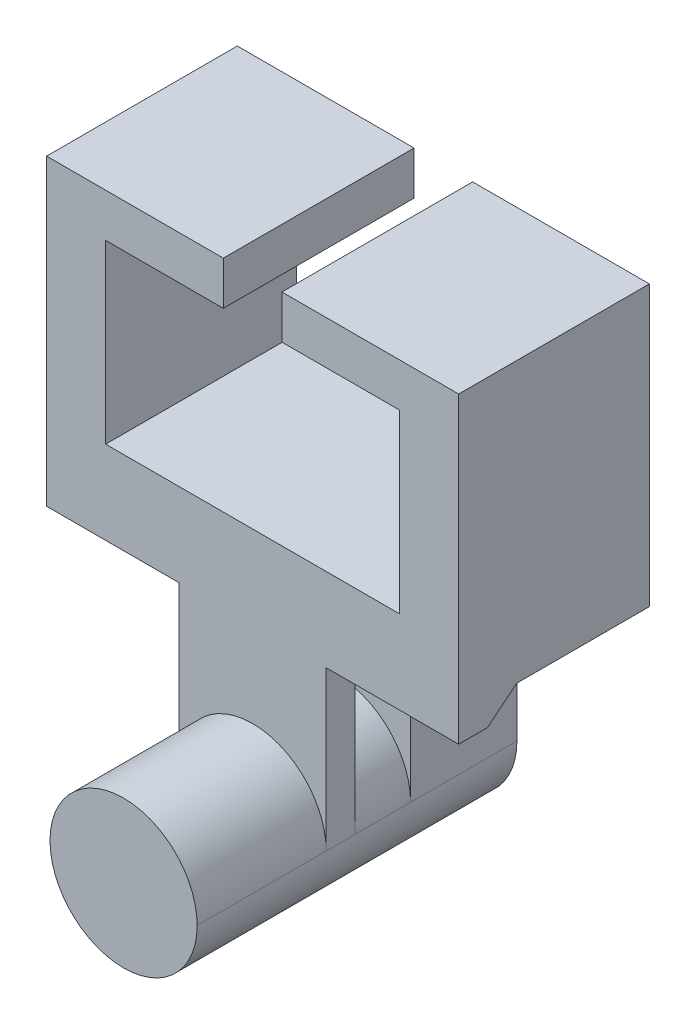
ISO-10303-21;
HEADER;
FILE_DESCRIPTION(('STEP AP214'),'2;1');
FILE_NAME('part.step','',(''),(''),'','','');
FILE_SCHEMA(('AUTOMOTIVE_DESIGN { 1 0 10303 214 1 1 1 1 }'));
ENDSEC;
DATA;
#1=APPLICATION_CONTEXT('core data for automotive mechanical design processes');
#2=APPLICATION_PROTOCOL_DEFINITION('international standard','automotive_design',2000,#1);
#3=PRODUCT_CONTEXT('',#1,'mechanical');
#4=PRODUCT('Part','Part','',(#3));
#5=PRODUCT_RELATED_PRODUCT_CATEGORY('part','',(#4));
#6=PRODUCT_DEFINITION_FORMATION('','',#4);
#7=PRODUCT_DEFINITION_CONTEXT('part definition',#1,'design');
#8=PRODUCT_DEFINITION('design','',#6,#7);
#9=PRODUCT_DEFINITION_SHAPE('','',#8);
#10=(LENGTH_UNIT() NAMED_UNIT(*) SI_UNIT(.MILLI.,.METRE.));
#11=(NAMED_UNIT(*) PLANE_ANGLE_UNIT() SI_UNIT($,.RADIAN.));
#12=(NAMED_UNIT(*) SI_UNIT($,.STERADIAN.) SOLID_ANGLE_UNIT());
#13=UNCERTAINTY_MEASURE_WITH_UNIT(LENGTH_MEASURE(1.E-05),#10,'distance_accuracy_value','');
#14=(GEOMETRIC_REPRESENTATION_CONTEXT(3) GLOBAL_UNCERTAINTY_ASSIGNED_CONTEXT((#13)) GLOBAL_UNIT_ASSIGNED_CONTEXT((#10,
#11,#12)) REPRESENTATION_CONTEXT('',''));
#15=CARTESIAN_POINT('',(0.,0.,0.));
#16=DIRECTION('',(0.,0.,1.));
#17=DIRECTION('',(1.,0.,0.));
#18=AXIS2_PLACEMENT_3D('',#15,#16,#17);
#19=CARTESIAN_POINT('',(0.,39.37,0.));
#20=DIRECTION('',(0.,1.,0.));
#21=DIRECTION('',(0.,0.,1.));
#22=AXIS2_PLACEMENT_3D('',#19,#20,#21);
#23=PLANE('',#22);
#24=DIRECTION('',(0.,0.,1.));
#25=VECTOR('',#24,1.);
#26=CARTESIAN_POINT('',(44.45,39.37,22.95525));
#27=LINE('',#26,#25);
#28=CARTESIAN_POINT('',(44.45,39.37,4.7625));
#29=VERTEX_POINT('',#28);
#30=CARTESIAN_POINT('',(44.45,39.37,10.401879312551));
#31=VERTEX_POINT('',#30);
#32=EDGE_CURVE('E264',#29,#31,#27,.T.);
#33=ORIENTED_EDGE('',*,*,#32,.T.);
#34=DIRECTION('',(1.,0.,0.));
#35=VECTOR('',#34,1.);
#36=CARTESIAN_POINT('',(15.875,39.37,10.401879312551));
#37=LINE('',#36,#35);
#38=CARTESIAN_POINT('',(-44.45,39.37,10.401879312551));
#39=VERTEX_POINT('',#38);
#40=EDGE_CURVE('E73',#39,#31,#37,.T.);
#41=ORIENTED_EDGE('',*,*,#40,.F.);
#42=DIRECTION('',(0.,0.,-1.));
#43=VECTOR('',#42,1.);
#44=CARTESIAN_POINT('',(-44.45,39.37,-18.19275));
#45=LINE('',#44,#43);
#46=CARTESIAN_POINT('',(-44.45,39.37,4.7625));
#47=VERTEX_POINT('',#46);
#48=EDGE_CURVE('E454',#39,#47,#45,.T.);
#49=ORIENTED_EDGE('',*,*,#48,.T.);
#50=DIRECTION('',(-1.,0.,0.));
#51=VECTOR('',#50,1.);
#52=CARTESIAN_POINT('',(-15.875,39.37,4.7625));
#53=LINE('',#52,#51);
#54=EDGE_CURVE('E450',#29,#47,#53,.T.);
#55=ORIENTED_EDGE('',*,*,#54,.F.);
#56=EDGE_LOOP('',(#33,#41,#49,#55));
#57=FACE_BOUND('',#56,.T.);
#58=ADVANCED_FACE('F56',(#57),#23,.F.);
#59=CARTESIAN_POINT('',(15.875,-15.877,22.95525));
#60=DIRECTION('',(-1.,0.,0.));
#61=DIRECTION('',(0.,0.,1.));
#62=AXIS2_PLACEMENT_3D('',#59,#60,#61);
#63=PLANE('',#62);
#64=DIRECTION('',(0.,0.,-1.));
#65=VECTOR('',#64,1.);
#66=CARTESIAN_POINT('',(15.875,34.2396768278377,16.751879312551));
#67=LINE('',#66,#65);
#68=CARTESIAN_POINT('',(15.875,34.2396768278377,22.95525));
#69=VERTEX_POINT('',#68);
#70=CARTESIAN_POINT('',(15.875,34.2396768278377,16.751879312551));
#71=VERTEX_POINT('',#70);
#72=EDGE_CURVE('E237',#69,#71,#67,.T.);
#73=ORIENTED_EDGE('',*,*,#72,.F.);
#74=DIRECTION('',(0.,1.,0.));
#75=VECTOR('',#74,1.);
#76=CARTESIAN_POINT('',(15.875,-15.877,22.95525));
#77=LINE('',#76,#75);
#78=CARTESIAN_POINT('',(15.875,0.,22.95525));
#79=VERTEX_POINT('',#78);
#80=EDGE_CURVE('E250',#79,#69,#77,.T.);
#81=ORIENTED_EDGE('',*,*,#80,.F.);
#82=DIRECTION('',(0.,0.,-1.));
#83=VECTOR('',#82,1.);
#84=CARTESIAN_POINT('',(15.875,0.,50.8));
#85=LINE('',#84,#83);
#86=CARTESIAN_POINT('',(15.875,0.,16.751879312551));
#87=VERTEX_POINT('',#86);
#88=EDGE_CURVE('E271',#87,#79,#85,.F.);
#89=ORIENTED_EDGE('',*,*,#88,.F.);
#90=DIRECTION('',(0.,1.,0.));
#91=VECTOR('',#90,1.);
#92=CARTESIAN_POINT('',(15.875,-15.877,16.751879312551));
#93=LINE('',#92,#91);
#94=EDGE_CURVE('E252',#87,#71,#93,.T.);
#95=ORIENTED_EDGE('',*,*,#94,.T.);
#96=EDGE_LOOP('',(#73,#81,#89,#95));
#97=FACE_BOUND('',#96,.T.);
#98=ADVANCED_FACE('F248',(#97),#63,.F.);
#99=CARTESIAN_POINT('',(-15.875,-15.877,22.95525));
#100=DIRECTION('',(1.,0.,0.));
#101=DIRECTION('',(0.,0.,-1.));
#102=AXIS2_PLACEMENT_3D('',#99,#100,#101);
#103=PLANE('',#102);
#104=DIRECTION('',(0.,0.,1.));
#105=VECTOR('',#104,1.);
#106=CARTESIAN_POINT('',(-15.875,34.2396768278377,16.751879312551));
#107=LINE('',#106,#105);
#108=CARTESIAN_POINT('',(-15.875,34.2396768278377,16.751879312551));
#109=VERTEX_POINT('',#108);
#110=CARTESIAN_POINT('',(-15.875,34.2396768278377,22.95525));
#111=VERTEX_POINT('',#110);
#112=EDGE_CURVE('E477',#109,#111,#107,.T.);
#113=ORIENTED_EDGE('',*,*,#112,.F.);
#114=DIRECTION('',(0.,1.,0.));
#115=VECTOR('',#114,1.);
#116=CARTESIAN_POINT('',(-15.875,-15.877,16.751879312551));
#117=LINE('',#116,#115);
#118=CARTESIAN_POINT('',(-15.875,0.,16.751879312551));
#119=VERTEX_POINT('',#118);
#120=EDGE_CURVE('E262',#119,#109,#117,.T.);
#121=ORIENTED_EDGE('',*,*,#120,.F.);
#122=DIRECTION('',(0.,0.,-1.));
#123=VECTOR('',#122,1.);
#124=CARTESIAN_POINT('',(-15.875,0.,50.8));
#125=LINE('',#124,#123);
#126=CARTESIAN_POINT('',(-15.875,0.,22.95525));
#127=VERTEX_POINT('',#126);
#128=EDGE_CURVE('E275',#119,#127,#125,.F.);
#129=ORIENTED_EDGE('',*,*,#128,.T.);
#130=DIRECTION('',(0.,1.,0.));
#131=VECTOR('',#130,1.);
#132=CARTESIAN_POINT('',(-15.875,-15.877,22.95525));
#133=LINE('',#132,#131);
#134=EDGE_CURVE('E81',#127,#111,#133,.T.);
#135=ORIENTED_EDGE('',*,*,#134,.T.);
#136=EDGE_LOOP('',(#113,#121,#129,#135));
#137=FACE_BOUND('',#136,.T.);
#138=ADVANCED_FACE('F478',(#137),#103,.F.);
#139=CARTESIAN_POINT('',(-15.875,0.,4.7625));
#140=DIRECTION('',(-1.,0.,0.));
#141=DIRECTION('',(0.,0.,1.));
#142=AXIS2_PLACEMENT_3D('',#139,#140,#141);
#143=PLANE('',#142);
#144=DIRECTION('',(0.,1.,0.));
#145=VECTOR('',#144,1.);
#146=CARTESIAN_POINT('',(-15.875,0.,4.7625));
#147=LINE('',#146,#145);
#148=CARTESIAN_POINT('',(-15.875,0.,4.7625));
#149=VERTEX_POINT('',#148);
#150=CARTESIAN_POINT('',(-15.875,33.02,4.7625));
#151=VERTEX_POINT('',#150);
#152=EDGE_CURVE('E346',#149,#151,#147,.T.);
#153=ORIENTED_EDGE('',*,*,#152,.T.);
#154=DIRECTION('',(0.,0.,1.));
#155=VECTOR('',#154,1.);
#156=CARTESIAN_POINT('',(-15.875,33.02,4.7625));
#157=LINE('',#156,#155);
#158=CARTESIAN_POINT('',(-15.875,33.02,-18.19275));
#159=VERTEX_POINT('',#158);
#160=EDGE_CURVE('E522',#159,#151,#157,.T.);
#161=ORIENTED_EDGE('',*,*,#160,.F.);
#162=DIRECTION('',(0.,-1.,0.));
#163=VECTOR('',#162,1.);
#164=CARTESIAN_POINT('',(-15.875,39.37,-18.19275));
#165=LINE('',#164,#163);
#166=CARTESIAN_POINT('',(-15.875,0.,-18.19275));
#167=VERTEX_POINT('',#166);
#168=EDGE_CURVE('E533',#159,#167,#165,.T.);
#169=ORIENTED_EDGE('',*,*,#168,.T.);
#170=DIRECTION('',(0.,0.,-1.));
#171=VECTOR('',#170,1.);
#172=CARTESIAN_POINT('',(-15.875,0.,4.7625));
#173=LINE('',#172,#171);
#174=EDGE_CURVE('E353',#149,#167,#173,.T.);
#175=ORIENTED_EDGE('',*,*,#174,.F.);
#176=EDGE_LOOP('',(#153,#161,#169,#175));
#177=FACE_BOUND('',#176,.T.);
#178=ADVANCED_FACE('F607',(#177),#143,.T.);
#179=CARTESIAN_POINT('',(-15.875,-15.877,16.751879312551));
#180=DIRECTION('',(0.,0.,1.));
#181=DIRECTION('',(1.,0.,0.));
#182=AXIS2_PLACEMENT_3D('',#179,#180,#181);
#183=PLANE('',#182);
#184=DIRECTION('',(-1.,0.,0.));
#185=VECTOR('',#184,1.);
#186=CARTESIAN_POINT('',(15.875,34.2396768278377,16.751879312551));
#187=LINE('',#186,#185);
#188=EDGE_CURVE('E439',#71,#109,#187,.T.);
#189=ORIENTED_EDGE('',*,*,#188,.F.);
#190=ORIENTED_EDGE('',*,*,#94,.F.);
#191=CARTESIAN_POINT('',(0.,0.,16.751879312551));
#192=DIRECTION('',(0.,0.,1.));
#193=DIRECTION('',(1.,0.,0.));
#194=AXIS2_PLACEMENT_3D('',#191,#192,#193);
#195=CIRCLE('',#194,15.875);
#196=EDGE_CURVE('E274',#119,#87,#195,.F.);
#197=ORIENTED_EDGE('',*,*,#196,.F.);
#198=ORIENTED_EDGE('',*,*,#120,.T.);
#199=EDGE_LOOP('',(#189,#190,#197,#198));
#200=FACE_BOUND('',#199,.T.);
#201=ADVANCED_FACE('F464',(#200),#183,.F.);
#202=CARTESIAN_POINT('',(15.875,0.,4.7625));
#203=DIRECTION('',(1.,0.,0.));
#204=DIRECTION('',(0.,0.,-1.));
#205=AXIS2_PLACEMENT_3D('',#202,#203,#204);
#206=PLANE('',#205);
#207=DIRECTION('',(0.,0.,-1.));
#208=VECTOR('',#207,1.);
#209=CARTESIAN_POINT('',(15.875,33.02,4.7625));
#210=LINE('',#209,#208);
#211=CARTESIAN_POINT('',(15.875,33.02,4.7625));
#212=VERTEX_POINT('',#211);
#213=CARTESIAN_POINT('',(15.875,33.02,-18.19275));
#214=VERTEX_POINT('',#213);
#215=EDGE_CURVE('E510',#212,#214,#210,.T.);
#216=ORIENTED_EDGE('',*,*,#215,.F.);
#217=DIRECTION('',(0.,-1.,0.));
#218=VECTOR('',#217,1.);
#219=CARTESIAN_POINT('',(15.875,0.,4.7625));
#220=LINE('',#219,#218);
#221=CARTESIAN_POINT('',(15.875,0.,4.7625));
#222=VERTEX_POINT('',#221);
#223=EDGE_CURVE('E341',#212,#222,#220,.T.);
#224=ORIENTED_EDGE('',*,*,#223,.T.);
#225=DIRECTION('',(0.,0.,-1.));
#226=VECTOR('',#225,1.);
#227=CARTESIAN_POINT('',(15.875,0.,4.7625));
#228=LINE('',#227,#226);
#229=CARTESIAN_POINT('',(15.875,0.,-18.19275));
#230=VERTEX_POINT('',#229);
#231=EDGE_CURVE('E352',#222,#230,#228,.T.);
#232=ORIENTED_EDGE('',*,*,#231,.T.);
#233=DIRECTION('',(0.,1.,0.));
#234=VECTOR('',#233,1.);
#235=CARTESIAN_POINT('',(15.875,39.37,-18.19275));
#236=LINE('',#235,#234);
#237=EDGE_CURVE('E474',#230,#214,#236,.T.);
#238=ORIENTED_EDGE('',*,*,#237,.T.);
#239=EDGE_LOOP('',(#216,#224,#232,#238));
#240=FACE_BOUND('',#239,.T.);
#241=ADVANCED_FACE('F606',(#240),#206,.T.);
#242=CARTESIAN_POINT('',(0.,0.,4.7625));
#243=DIRECTION('',(0.,0.,1.));
#244=DIRECTION('',(1.,0.,0.));
#245=AXIS2_PLACEMENT_3D('',#242,#243,#244);
#246=PLANE('',#245);
#247=DIRECTION('',(-0.975404269823902,0.220423479714163,0.));
#248=VECTOR('',#247,1.);
#249=CARTESIAN_POINT('',(-44.45,39.37,4.7625));
#250=LINE('',#249,#248);
#251=CARTESIAN_POINT('',(-16.3503750353016,33.02,4.7625));
#252=VERTEX_POINT('',#251);
#253=EDGE_CURVE('E501',#252,#47,#250,.T.);
#254=ORIENTED_EDGE('',*,*,#253,.F.);
#255=DIRECTION('',(-1.,0.,0.));
#256=VECTOR('',#255,1.);
#257=CARTESIAN_POINT('',(-15.875,33.02,4.7625));
#258=LINE('',#257,#256);
#259=EDGE_CURVE('E526',#151,#252,#258,.T.);
#260=ORIENTED_EDGE('',*,*,#259,.F.);
#261=ORIENTED_EDGE('',*,*,#152,.F.);
#262=CARTESIAN_POINT('',(0.,0.,4.7625));
#263=DIRECTION('',(0.,0.,1.));
#264=DIRECTION('',(1.,0.,0.));
#265=AXIS2_PLACEMENT_3D('',#262,#263,#264);
#266=CIRCLE('',#265,15.875);
#267=EDGE_CURVE('E646',#222,#149,#266,.T.);
#268=ORIENTED_EDGE('',*,*,#267,.F.);
#269=ORIENTED_EDGE('',*,*,#223,.F.);
#270=DIRECTION('',(-0.976187060183953,-0.216930457818656,0.));
#271=VECTOR('',#270,1.);
#272=CARTESIAN_POINT('',(15.875,33.02,4.7625));
#273=LINE('',#272,#271);
#274=EDGE_CURVE('E505',#29,#212,#273,.T.);
#275=ORIENTED_EDGE('',*,*,#274,.F.);
#276=ORIENTED_EDGE('',*,*,#54,.T.);
#277=EDGE_LOOP('',(#254,#260,#261,#268,#269,#275,#276));
#278=FACE_BOUND('',#277,.T.);
#279=ADVANCED_FACE('F617',(#278),#246,.T.);
#280=CARTESIAN_POINT('',(0.,0.,50.8));
#281=DIRECTION('',(0.,0.,-1.));
#282=DIRECTION('',(-1.,0.,0.));
#283=AXIS2_PLACEMENT_3D('',#280,#281,#282);
#284=CYLINDRICAL_SURFACE('',#283,15.875);
#285=CARTESIAN_POINT('',(0.,0.,22.95525));
#286=DIRECTION('',(0.,0.,-1.));
#287=DIRECTION('',(-1.,0.,0.));
#288=AXIS2_PLACEMENT_3D('',#285,#286,#287);
#289=CIRCLE('',#288,15.875);
#290=EDGE_CURVE('E257',#79,#127,#289,.F.);
#291=ORIENTED_EDGE('',*,*,#290,.T.);
#292=DIRECTION('',(0.,0.,-1.));
#293=VECTOR('',#292,1.);
#294=CARTESIAN_POINT('',(-15.875,0.,50.8));
#295=LINE('',#294,#293);
#296=CARTESIAN_POINT('',(-15.875,0.,50.8));
#297=VERTEX_POINT('',#296);
#298=EDGE_CURVE('E12',#297,#127,#295,.T.);
#299=ORIENTED_EDGE('',*,*,#298,.F.);
#300=CARTESIAN_POINT('',(0.,0.,50.8));
#301=DIRECTION('',(0.,0.,1.));
#302=DIRECTION('',(1.,0.,0.));
#303=AXIS2_PLACEMENT_3D('',#300,#301,#302);
#304=CIRCLE('',#303,15.875);
#305=CARTESIAN_POINT('',(0.,15.875,50.8));
#306=VERTEX_POINT('',#305);
#307=EDGE_CURVE('E641',#306,#297,#304,.T.);
#308=ORIENTED_EDGE('',*,*,#307,.F.);
#309=CARTESIAN_POINT('',(15.875,0.,50.8));
#310=VERTEX_POINT('',#309);
#311=EDGE_CURVE('E639',#310,#306,#304,.T.);
#312=ORIENTED_EDGE('',*,*,#311,.F.);
#313=DIRECTION('',(0.,0.,-1.));
#314=VECTOR('',#313,1.);
#315=CARTESIAN_POINT('',(15.875,0.,50.8));
#316=LINE('',#315,#314);
#317=EDGE_CURVE('E841',#310,#79,#316,.T.);
#318=ORIENTED_EDGE('',*,*,#317,.T.);
#319=EDGE_LOOP('',(#291,#299,#308,#312,#318));
#320=FACE_BOUND('',#319,.T.);
#321=ADVANCED_FACE('F634',(#320),#284,.T.);
#322=ORIENTED_EDGE('',*,*,#196,.T.);
#323=EDGE_CURVE('E650',#87,#222,#316,.T.);
#324=ORIENTED_EDGE('',*,*,#323,.T.);
#325=ORIENTED_EDGE('',*,*,#267,.T.);
#326=EDGE_CURVE('E66',#119,#149,#295,.T.);
#327=ORIENTED_EDGE('',*,*,#326,.F.);
#328=EDGE_LOOP('',(#322,#324,#325,#327));
#329=FACE_BOUND('',#328,.T.);
#330=ADVANCED_FACE('F632',(#329),#284,.T.);
#331=CARTESIAN_POINT('',(0.,0.,-18.19275));
#332=DIRECTION('',(0.,0.,1.));
#333=DIRECTION('',(1.,0.,0.));
#334=AXIS2_PLACEMENT_3D('',#331,#332,#333);
#335=CIRCLE('',#334,15.875);
#336=EDGE_CURVE('E538',#167,#230,#335,.T.);
#337=ORIENTED_EDGE('',*,*,#336,.T.);
#338=ORIENTED_EDGE('',*,*,#231,.F.);
#339=ORIENTED_EDGE('',*,*,#323,.F.);
#340=ORIENTED_EDGE('',*,*,#88,.T.);
#341=ORIENTED_EDGE('',*,*,#317,.F.);
#342=CARTESIAN_POINT('',(0.,-15.875,50.8));
#343=VERTEX_POINT('',#342);
#344=EDGE_CURVE('E642',#343,#310,#304,.T.);
#345=ORIENTED_EDGE('',*,*,#344,.F.);
#346=EDGE_CURVE('E652',#297,#343,#304,.T.);
#347=ORIENTED_EDGE('',*,*,#346,.F.);
#348=ORIENTED_EDGE('',*,*,#298,.T.);
#349=ORIENTED_EDGE('',*,*,#128,.F.);
#350=ORIENTED_EDGE('',*,*,#326,.T.);
#351=ORIENTED_EDGE('',*,*,#174,.T.);
#352=EDGE_LOOP('',(#337,#338,#339,#340,#341,#345,#347,#348,#349,#350,#351));
#353=FACE_BOUND('',#352,.T.);
#354=ADVANCED_FACE('F58',(#353),#284,.T.);
#355=CARTESIAN_POINT('',(0.,0.,50.8));
#356=DIRECTION('',(0.,0.,1.));
#357=DIRECTION('',(1.,0.,0.));
#358=AXIS2_PLACEMENT_3D('',#355,#356,#357);
#359=PLANE('',#358);
#360=ORIENTED_EDGE('',*,*,#311,.T.);
#361=ORIENTED_EDGE('',*,*,#307,.T.);
#362=ORIENTED_EDGE('',*,*,#346,.T.);
#363=ORIENTED_EDGE('',*,*,#344,.T.);
#364=EDGE_LOOP('',(#360,#361,#362,#363));
#365=FACE_BOUND('',#364,.T.);
#366=ADVANCED_FACE('F621',(#365),#359,.T.);
#367=CARTESIAN_POINT('',(44.45,92.0496,22.95525));
#368=DIRECTION('',(-1.,0.,0.));
#369=DIRECTION('',(0.,0.,1.));
#370=AXIS2_PLACEMENT_3D('',#367,#368,#369);
#371=PLANE('',#370);
#372=ORIENTED_EDGE('',*,*,#32,.F.);
#373=DIRECTION('',(0.,0.,1.));
#374=VECTOR('',#373,1.);
#375=CARTESIAN_POINT('',(44.45,39.37,-18.19275));
#376=LINE('',#375,#374);
#377=CARTESIAN_POINT('',(44.45,39.37,-18.19275));
#378=VERTEX_POINT('',#377);
#379=EDGE_CURVE('E513',#378,#29,#376,.T.);
#380=ORIENTED_EDGE('',*,*,#379,.F.);
#381=DIRECTION('',(0.,-1.,0.));
#382=VECTOR('',#381,1.);
#383=CARTESIAN_POINT('',(44.45,92.0496,-18.19275));
#384=LINE('',#383,#382);
#385=CARTESIAN_POINT('',(44.45,99.6696,-18.19275));
#386=VERTEX_POINT('',#385);
#387=EDGE_CURVE('E347',#386,#378,#384,.T.);
#388=ORIENTED_EDGE('',*,*,#387,.F.);
#389=DIRECTION('',(0.,0.,-1.));
#390=VECTOR('',#389,1.);
#391=CARTESIAN_POINT('',(44.45,99.6696,-18.19275));
#392=LINE('',#391,#390);
#393=CARTESIAN_POINT('',(44.45,99.6696,22.95525));
#394=VERTEX_POINT('',#393);
#395=EDGE_CURVE('E437',#394,#386,#392,.T.);
#396=ORIENTED_EDGE('',*,*,#395,.F.);
#397=DIRECTION('',(0.,-1.,0.));
#398=VECTOR('',#397,1.);
#399=CARTESIAN_POINT('',(44.45,92.0496,22.95525));
#400=LINE('',#399,#398);
#401=CARTESIAN_POINT('',(44.45,34.2396768278377,22.95525));
#402=VERTEX_POINT('',#401);
#403=EDGE_CURVE('E376',#394,#402,#400,.T.);
#404=ORIENTED_EDGE('',*,*,#403,.T.);
#405=DIRECTION('',(0.,0.,1.));
#406=VECTOR('',#405,1.);
#407=CARTESIAN_POINT('',(44.45,34.2396768278377,16.751879312551));
#408=LINE('',#407,#406);
#409=CARTESIAN_POINT('',(44.45,34.2396768278377,16.751879312551));
#410=VERTEX_POINT('',#409);
#411=EDGE_CURVE('E239',#410,#402,#408,.T.);
#412=ORIENTED_EDGE('',*,*,#411,.F.);
#413=DIRECTION('',(0.,-0.628446598075217,0.777852732442129));
#414=VECTOR('',#413,1.);
#415=CARTESIAN_POINT('',(44.45,39.37,10.401879312551));
#416=LINE('',#415,#414);
#417=EDGE_CURVE('E483',#31,#410,#416,.T.);
#418=ORIENTED_EDGE('',*,*,#417,.F.);
#419=EDGE_LOOP('',(#372,#380,#388,#396,#404,#412,#418));
#420=FACE_BOUND('',#419,.T.);
#421=ADVANCED_FACE('F623',(#420),#371,.F.);
#422=CARTESIAN_POINT('',(-44.45,92.0496,-18.19275));
#423=DIRECTION('',(0.,0.,1.));
#424=DIRECTION('',(1.,0.,0.));
#425=AXIS2_PLACEMENT_3D('',#422,#423,#424);
#426=PLANE('',#425);
#427=DIRECTION('',(1.,0.,0.));
#428=VECTOR('',#427,1.);
#429=CARTESIAN_POINT('',(-15.875,33.02,-18.19275));
#430=LINE('',#429,#428);
#431=CARTESIAN_POINT('',(-16.3503750353016,33.02,-18.19275));
#432=VERTEX_POINT('',#431);
#433=EDGE_CURVE('E530',#432,#159,#430,.T.);
#434=ORIENTED_EDGE('',*,*,#433,.F.);
#435=DIRECTION('',(-0.975404269823902,0.220423479714163,0.));
#436=VECTOR('',#435,1.);
#437=CARTESIAN_POINT('',(-44.45,39.37,-18.19275));
#438=LINE('',#437,#436);
#439=CARTESIAN_POINT('',(-44.45,39.37,-18.19275));
#440=VERTEX_POINT('',#439);
#441=EDGE_CURVE('E496',#432,#440,#438,.T.);
#442=ORIENTED_EDGE('',*,*,#441,.T.);
#443=DIRECTION('',(0.,-1.,0.));
#444=VECTOR('',#443,1.);
#445=CARTESIAN_POINT('',(-44.45,92.0496,-18.19275));
#446=LINE('',#445,#444);
#447=CARTESIAN_POINT('',(-44.45,99.6696,-18.19275));
#448=VERTEX_POINT('',#447);
#449=EDGE_CURVE('E375',#448,#440,#446,.T.);
#450=ORIENTED_EDGE('',*,*,#449,.F.);
#451=DIRECTION('',(-1.,0.,0.));
#452=VECTOR('',#451,1.);
#453=CARTESIAN_POINT('',(-44.45,99.6696,-18.19275));
#454=LINE('',#453,#452);
#455=CARTESIAN_POINT('',(-6.3246,99.6696,-18.19275));
#456=VERTEX_POINT('',#455);
#457=EDGE_CURVE('E442',#456,#448,#454,.T.);
#458=ORIENTED_EDGE('',*,*,#457,.F.);
#459=DIRECTION('',(0.,-1.,0.));
#460=VECTOR('',#459,1.);
#461=CARTESIAN_POINT('',(-6.3246,92.0496,-18.19275));
#462=LINE('',#461,#460);
#463=CARTESIAN_POINT('',(-6.3246,90.297,-18.19275));
#464=VERTEX_POINT('',#463);
#465=EDGE_CURVE('E281',#456,#464,#462,.T.);
#466=ORIENTED_EDGE('',*,*,#465,.T.);
#467=DIRECTION('',(-1.,0.,0.));
#468=VECTOR('',#467,1.);
#469=CARTESIAN_POINT('',(-6.3246,90.297,-18.19275));
#470=LINE('',#469,#468);
#471=CARTESIAN_POINT('',(-31.70428,90.297,-18.19275));
#472=VERTEX_POINT('',#471);
#473=EDGE_CURVE('E285',#464,#472,#470,.T.);
#474=ORIENTED_EDGE('',*,*,#473,.T.);
#475=DIRECTION('',(0.,-1.,0.));
#476=VECTOR('',#475,1.);
#477=CARTESIAN_POINT('',(-31.70428,90.297,-18.19275));
#478=LINE('',#477,#476);
#479=CARTESIAN_POINT('',(-31.70428,52.2224,-18.19275));
#480=VERTEX_POINT('',#479);
#481=EDGE_CURVE('E291',#472,#480,#478,.T.);
#482=ORIENTED_EDGE('',*,*,#481,.T.);
#483=DIRECTION('',(1.,0.,0.));
#484=VECTOR('',#483,1.);
#485=CARTESIAN_POINT('',(-31.70428,52.2224,-18.19275));
#486=LINE('',#485,#484);
#487=CARTESIAN_POINT('',(31.70428,52.2224,-18.19275));
#488=VERTEX_POINT('',#487);
#489=EDGE_CURVE('E581',#480,#488,#486,.T.);
#490=ORIENTED_EDGE('',*,*,#489,.T.);
#491=DIRECTION('',(0.,1.,0.));
#492=VECTOR('',#491,1.);
#493=CARTESIAN_POINT('',(31.70428,52.2224,-18.19275));
#494=LINE('',#493,#492);
#495=CARTESIAN_POINT('',(31.70428,90.297,-18.19275));
#496=VERTEX_POINT('',#495);
#497=EDGE_CURVE('E310',#488,#496,#494,.T.);
#498=ORIENTED_EDGE('',*,*,#497,.T.);
#499=DIRECTION('',(-1.,0.,0.));
#500=VECTOR('',#499,1.);
#501=CARTESIAN_POINT('',(31.70428,90.297,-18.19275));
#502=LINE('',#501,#500);
#503=CARTESIAN_POINT('',(6.3246,90.297,-18.19275));
#504=VERTEX_POINT('',#503);
#505=EDGE_CURVE('E303',#496,#504,#502,.T.);
#506=ORIENTED_EDGE('',*,*,#505,.T.);
#507=DIRECTION('',(0.,1.,0.));
#508=VECTOR('',#507,1.);
#509=CARTESIAN_POINT('',(6.3246,90.297,-18.19275));
#510=LINE('',#509,#508);
#511=CARTESIAN_POINT('',(6.3246,99.6696,-18.19275));
#512=VERTEX_POINT('',#511);
#513=EDGE_CURVE('E309',#504,#512,#510,.T.);
#514=ORIENTED_EDGE('',*,*,#513,.T.);
#515=DIRECTION('',(-1.,0.,0.));
#516=VECTOR('',#515,1.);
#517=CARTESIAN_POINT('',(6.3246,99.6696,-18.19275));
#518=LINE('',#517,#516);
#519=EDGE_CURVE('E432',#386,#512,#518,.T.);
#520=ORIENTED_EDGE('',*,*,#519,.F.);
#521=ORIENTED_EDGE('',*,*,#387,.T.);
#522=DIRECTION('',(-0.976187060183953,-0.216930457818656,0.));
#523=VECTOR('',#522,1.);
#524=CARTESIAN_POINT('',(15.875,33.02,-18.19275));
#525=LINE('',#524,#523);
#526=EDGE_CURVE('E516',#378,#214,#525,.T.);
#527=ORIENTED_EDGE('',*,*,#526,.T.);
#528=ORIENTED_EDGE('',*,*,#237,.F.);
#529=ORIENTED_EDGE('',*,*,#336,.F.);
#530=ORIENTED_EDGE('',*,*,#168,.F.);
#531=EDGE_LOOP('',(#434,#442,#450,#458,#466,#474,#482,#490,#498,#506,#514,#520,#521,#527,#528,
#529,#530));
#532=FACE_BOUND('',#531,.T.);
#533=ADVANCED_FACE('F570',(#532),#426,.F.);
#534=CARTESIAN_POINT('',(-44.45,92.0496,22.95525));
#535=DIRECTION('',(1.,0.,0.));
#536=DIRECTION('',(0.,0.,-1.));
#537=AXIS2_PLACEMENT_3D('',#534,#535,#536);
#538=PLANE('',#537);
#539=ORIENTED_EDGE('',*,*,#449,.T.);
#540=DIRECTION('',(0.,0.,1.));
#541=VECTOR('',#540,1.);
#542=CARTESIAN_POINT('',(-44.45,39.37,-18.19275));
#543=LINE('',#542,#541);
#544=EDGE_CURVE('E506',#440,#47,#543,.T.);
#545=ORIENTED_EDGE('',*,*,#544,.T.);
#546=ORIENTED_EDGE('',*,*,#48,.F.);
#547=DIRECTION('',(0.,0.628446598075217,-0.777852732442129));
#548=VECTOR('',#547,1.);
#549=CARTESIAN_POINT('',(-44.45,39.37,10.401879312551));
#550=LINE('',#549,#548);
#551=CARTESIAN_POINT('',(-44.45,34.2396768278377,16.751879312551));
#552=VERTEX_POINT('',#551);
#553=EDGE_CURVE('E492',#552,#39,#550,.T.);
#554=ORIENTED_EDGE('',*,*,#553,.F.);
#555=DIRECTION('',(0.,0.,-1.));
#556=VECTOR('',#555,1.);
#557=CARTESIAN_POINT('',(-44.45,34.2396768278377,16.751879312551));
#558=LINE('',#557,#556);
#559=CARTESIAN_POINT('',(-44.45,34.2396768278377,22.95525));
#560=VERTEX_POINT('',#559);
#561=EDGE_CURVE('E487',#560,#552,#558,.T.);
#562=ORIENTED_EDGE('',*,*,#561,.F.);
#563=DIRECTION('',(0.,-1.,0.));
#564=VECTOR('',#563,1.);
#565=CARTESIAN_POINT('',(-44.45,92.0496,22.95525));
#566=LINE('',#565,#564);
#567=CARTESIAN_POINT('',(-44.45,99.6696,22.95525));
#568=VERTEX_POINT('',#567);
#569=EDGE_CURVE('E371',#568,#560,#566,.T.);
#570=ORIENTED_EDGE('',*,*,#569,.F.);
#571=DIRECTION('',(0.,0.,1.));
#572=VECTOR('',#571,1.);
#573=CARTESIAN_POINT('',(-44.45,99.6696,-18.19275));
#574=LINE('',#573,#572);
#575=EDGE_CURVE('E449',#448,#568,#574,.T.);
#576=ORIENTED_EDGE('',*,*,#575,.F.);
#577=EDGE_LOOP('',(#539,#545,#546,#554,#562,#570,#576));
#578=FACE_BOUND('',#577,.T.);
#579=ADVANCED_FACE('F563',(#578),#538,.F.);
#580=CARTESIAN_POINT('',(-44.45,92.0496,22.95525));
#581=DIRECTION('',(0.,0.,-1.));
#582=DIRECTION('',(-1.,0.,0.));
#583=AXIS2_PLACEMENT_3D('',#580,#581,#582);
#584=PLANE('',#583);
#585=ORIENTED_EDGE('',*,*,#80,.T.);
#586=DIRECTION('',(-1.,0.,0.));
#587=VECTOR('',#586,1.);
#588=CARTESIAN_POINT('',(58.0112437286309,34.2396768278377,22.95525));
#589=LINE('',#588,#587);
#590=EDGE_CURVE('E233',#402,#69,#589,.T.);
#591=ORIENTED_EDGE('',*,*,#590,.F.);
#592=ORIENTED_EDGE('',*,*,#403,.F.);
#593=DIRECTION('',(1.,0.,0.));
#594=VECTOR('',#593,1.);
#595=CARTESIAN_POINT('',(6.3246,99.6696,22.95525));
#596=LINE('',#595,#594);
#597=CARTESIAN_POINT('',(6.3246,99.6696,22.95525));
#598=VERTEX_POINT('',#597);
#599=EDGE_CURVE('E420',#598,#394,#596,.T.);
#600=ORIENTED_EDGE('',*,*,#599,.F.);
#601=DIRECTION('',(0.,1.,0.));
#602=VECTOR('',#601,1.);
#603=CARTESIAN_POINT('',(6.3246,90.297,22.95525));
#604=LINE('',#603,#602);
#605=CARTESIAN_POINT('',(6.3246,90.297,22.95525));
#606=VERTEX_POINT('',#605);
#607=EDGE_CURVE('E286',#606,#598,#604,.T.);
#608=ORIENTED_EDGE('',*,*,#607,.F.);
#609=DIRECTION('',(-1.,0.,0.));
#610=VECTOR('',#609,1.);
#611=CARTESIAN_POINT('',(31.70428,90.297,22.95525));
#612=LINE('',#611,#610);
#613=CARTESIAN_POINT('',(31.70428,90.297,22.95525));
#614=VERTEX_POINT('',#613);
#615=EDGE_CURVE('E404',#614,#606,#612,.T.);
#616=ORIENTED_EDGE('',*,*,#615,.F.);
#617=DIRECTION('',(0.,1.,0.));
#618=VECTOR('',#617,1.);
#619=CARTESIAN_POINT('',(31.70428,52.2224,22.95525));
#620=LINE('',#619,#618);
#621=CARTESIAN_POINT('',(31.70428,52.2224,22.95525));
#622=VERTEX_POINT('',#621);
#623=EDGE_CURVE('E330',#622,#614,#620,.T.);
#624=ORIENTED_EDGE('',*,*,#623,.F.);
#625=DIRECTION('',(1.,0.,0.));
#626=VECTOR('',#625,1.);
#627=CARTESIAN_POINT('',(-31.70428,52.2224,22.95525));
#628=LINE('',#627,#626);
#629=CARTESIAN_POINT('',(-31.70428,52.2224,22.95525));
#630=VERTEX_POINT('',#629);
#631=EDGE_CURVE('E325',#630,#622,#628,.T.);
#632=ORIENTED_EDGE('',*,*,#631,.F.);
#633=DIRECTION('',(0.,-1.,0.));
#634=VECTOR('',#633,1.);
#635=CARTESIAN_POINT('',(-31.70428,90.297,22.95525));
#636=LINE('',#635,#634);
#637=CARTESIAN_POINT('',(-31.70428,90.297,22.95525));
#638=VERTEX_POINT('',#637);
#639=EDGE_CURVE('E321',#638,#630,#636,.T.);
#640=ORIENTED_EDGE('',*,*,#639,.F.);
#641=DIRECTION('',(-1.,0.,0.));
#642=VECTOR('',#641,1.);
#643=CARTESIAN_POINT('',(-6.3246,90.297,22.95525));
#644=LINE('',#643,#642);
#645=CARTESIAN_POINT('',(-6.3246,90.297,22.95525));
#646=VERTEX_POINT('',#645);
#647=EDGE_CURVE('E317',#646,#638,#644,.T.);
#648=ORIENTED_EDGE('',*,*,#647,.F.);
#649=DIRECTION('',(0.,-1.,0.));
#650=VECTOR('',#649,1.);
#651=CARTESIAN_POINT('',(-6.3246,92.0496,22.95525));
#652=LINE('',#651,#650);
#653=CARTESIAN_POINT('',(-6.3246,99.6696,22.95525));
#654=VERTEX_POINT('',#653);
#655=EDGE_CURVE('E270',#654,#646,#652,.T.);
#656=ORIENTED_EDGE('',*,*,#655,.F.);
#657=DIRECTION('',(1.,0.,0.));
#658=VECTOR('',#657,1.);
#659=CARTESIAN_POINT('',(-44.45,99.6696,22.95525));
#660=LINE('',#659,#658);
#661=EDGE_CURVE('E548',#568,#654,#660,.T.);
#662=ORIENTED_EDGE('',*,*,#661,.F.);
#663=ORIENTED_EDGE('',*,*,#569,.T.);
#664=DIRECTION('',(1.,0.,0.));
#665=VECTOR('',#664,1.);
#666=CARTESIAN_POINT('',(-58.0112437286309,34.2396768278377,22.95525));
#667=LINE('',#666,#665);
#668=EDGE_CURVE('E482',#560,#111,#667,.T.);
#669=ORIENTED_EDGE('',*,*,#668,.T.);
#670=ORIENTED_EDGE('',*,*,#134,.F.);
#671=ORIENTED_EDGE('',*,*,#290,.F.);
#672=EDGE_LOOP('',(#585,#591,#592,#600,#608,#616,#624,#632,#640,#648,#656,#662,#663,#669,#670,#671));
#673=FACE_BOUND('',#672,.T.);
#674=ADVANCED_FACE('F256',(#673),#584,.F.);
#675=CARTESIAN_POINT('',(6.3246,90.297,-18.19275));
#676=DIRECTION('',(1.,0.,0.));
#677=DIRECTION('',(0.,1.,0.));
#678=AXIS2_PLACEMENT_3D('',#675,#676,#677);
#679=PLANE('',#678);
#680=ORIENTED_EDGE('',*,*,#607,.T.);
#681=DIRECTION('',(0.,0.,1.));
#682=VECTOR('',#681,1.);
#683=CARTESIAN_POINT('',(6.3246,99.6696,-18.19275));
#684=LINE('',#683,#682);
#685=EDGE_CURVE('E426',#512,#598,#684,.T.);
#686=ORIENTED_EDGE('',*,*,#685,.F.);
#687=ORIENTED_EDGE('',*,*,#513,.F.);
#688=DIRECTION('',(0.,0.,1.));
#689=VECTOR('',#688,1.);
#690=CARTESIAN_POINT('',(6.3246,90.297,-18.19275));
#691=LINE('',#690,#689);
#692=EDGE_CURVE('E399',#504,#606,#691,.T.);
#693=ORIENTED_EDGE('',*,*,#692,.T.);
#694=EDGE_LOOP('',(#680,#686,#687,#693));
#695=FACE_BOUND('',#694,.T.);
#696=ADVANCED_FACE('F424',(#695),#679,.F.);
#697=CARTESIAN_POINT('',(31.70428,90.297,-18.19275));
#698=DIRECTION('',(0.,1.,0.));
#699=DIRECTION('',(-1.,0.,0.));
#700=AXIS2_PLACEMENT_3D('',#697,#698,#699);
#701=PLANE('',#700);
#702=ORIENTED_EDGE('',*,*,#615,.T.);
#703=ORIENTED_EDGE('',*,*,#692,.F.);
#704=ORIENTED_EDGE('',*,*,#505,.F.);
#705=DIRECTION('',(0.,0.,1.));
#706=VECTOR('',#705,1.);
#707=CARTESIAN_POINT('',(31.70428,90.297,-18.19275));
#708=LINE('',#707,#706);
#709=EDGE_CURVE('E397',#496,#614,#708,.T.);
#710=ORIENTED_EDGE('',*,*,#709,.T.);
#711=EDGE_LOOP('',(#702,#703,#704,#710));
#712=FACE_BOUND('',#711,.T.);
#713=ADVANCED_FACE('F585',(#712),#701,.F.);
#714=CARTESIAN_POINT('',(31.70428,52.2224,-18.19275));
#715=DIRECTION('',(1.,0.,0.));
#716=DIRECTION('',(0.,0.,-1.));
#717=AXIS2_PLACEMENT_3D('',#714,#715,#716);
#718=PLANE('',#717);
#719=ORIENTED_EDGE('',*,*,#623,.T.);
#720=ORIENTED_EDGE('',*,*,#709,.F.);
#721=ORIENTED_EDGE('',*,*,#497,.F.);
#722=DIRECTION('',(0.,0.,1.));
#723=VECTOR('',#722,1.);
#724=CARTESIAN_POINT('',(31.70428,52.2224,-18.19275));
#725=LINE('',#724,#723);
#726=EDGE_CURVE('E394',#488,#622,#725,.T.);
#727=ORIENTED_EDGE('',*,*,#726,.T.);
#728=EDGE_LOOP('',(#719,#720,#721,#727));
#729=FACE_BOUND('',#728,.T.);
#730=ADVANCED_FACE('F414',(#729),#718,.F.);
#731=CARTESIAN_POINT('',(-31.70428,52.2224,-18.19275));
#732=DIRECTION('',(0.,-1.,0.));
#733=DIRECTION('',(1.,0.,0.));
#734=AXIS2_PLACEMENT_3D('',#731,#732,#733);
#735=PLANE('',#734);
#736=ORIENTED_EDGE('',*,*,#631,.T.);
#737=ORIENTED_EDGE('',*,*,#726,.F.);
#738=ORIENTED_EDGE('',*,*,#489,.F.);
#739=DIRECTION('',(0.,0.,1.));
#740=VECTOR('',#739,1.);
#741=CARTESIAN_POINT('',(-31.70428,52.2224,-18.19275));
#742=LINE('',#741,#740);
#743=EDGE_CURVE('E391',#480,#630,#742,.T.);
#744=ORIENTED_EDGE('',*,*,#743,.T.);
#745=EDGE_LOOP('',(#736,#737,#738,#744));
#746=FACE_BOUND('',#745,.T.);
#747=ADVANCED_FACE('F591',(#746),#735,.F.);
#748=CARTESIAN_POINT('',(-31.70428,90.297,-18.19275));
#749=DIRECTION('',(-1.,0.,0.));
#750=DIRECTION('',(0.,-1.,0.));
#751=AXIS2_PLACEMENT_3D('',#748,#749,#750);
#752=PLANE('',#751);
#753=ORIENTED_EDGE('',*,*,#639,.T.);
#754=ORIENTED_EDGE('',*,*,#743,.F.);
#755=ORIENTED_EDGE('',*,*,#481,.F.);
#756=DIRECTION('',(0.,0.,1.));
#757=VECTOR('',#756,1.);
#758=CARTESIAN_POINT('',(-31.70428,90.297,-18.19275));
#759=LINE('',#758,#757);
#760=EDGE_CURVE('E388',#472,#638,#759,.T.);
#761=ORIENTED_EDGE('',*,*,#760,.T.);
#762=EDGE_LOOP('',(#753,#754,#755,#761));
#763=FACE_BOUND('',#762,.T.);
#764=ADVANCED_FACE('F578',(#763),#752,.F.);
#765=CARTESIAN_POINT('',(-6.3246,90.297,-18.19275));
#766=DIRECTION('',(0.,1.,0.));
#767=DIRECTION('',(0.,0.,1.));
#768=AXIS2_PLACEMENT_3D('',#765,#766,#767);
#769=PLANE('',#768);
#770=ORIENTED_EDGE('',*,*,#647,.T.);
#771=ORIENTED_EDGE('',*,*,#760,.F.);
#772=ORIENTED_EDGE('',*,*,#473,.F.);
#773=DIRECTION('',(0.,0.,1.));
#774=VECTOR('',#773,1.);
#775=CARTESIAN_POINT('',(-6.3246,90.297,-18.19275));
#776=LINE('',#775,#774);
#777=EDGE_CURVE('E313',#464,#646,#776,.T.);
#778=ORIENTED_EDGE('',*,*,#777,.T.);
#779=EDGE_LOOP('',(#770,#771,#772,#778));
#780=FACE_BOUND('',#779,.T.);
#781=ADVANCED_FACE('F575',(#780),#769,.F.);
#782=CARTESIAN_POINT('',(-6.3246,92.0496,-18.19275));
#783=DIRECTION('',(-1.,0.,0.));
#784=DIRECTION('',(0.,0.,1.));
#785=AXIS2_PLACEMENT_3D('',#782,#783,#784);
#786=PLANE('',#785);
#787=ORIENTED_EDGE('',*,*,#655,.T.);
#788=ORIENTED_EDGE('',*,*,#777,.F.);
#789=ORIENTED_EDGE('',*,*,#465,.F.);
#790=DIRECTION('',(0.,0.,-1.));
#791=VECTOR('',#790,1.);
#792=CARTESIAN_POINT('',(-6.3246,99.6696,-18.19275));
#793=LINE('',#792,#791);
#794=EDGE_CURVE('E551',#654,#456,#793,.T.);
#795=ORIENTED_EDGE('',*,*,#794,.F.);
#796=EDGE_LOOP('',(#787,#788,#789,#795));
#797=FACE_BOUND('',#796,.T.);
#798=ADVANCED_FACE('F567',(#797),#786,.F.);
#799=CARTESIAN_POINT('',(0.,99.6696,0.));
#800=DIRECTION('',(0.,1.,0.));
#801=DIRECTION('',(0.,0.,1.));
#802=AXIS2_PLACEMENT_3D('',#799,#800,#801);
#803=PLANE('',#802);
#804=ORIENTED_EDGE('',*,*,#575,.T.);
#805=ORIENTED_EDGE('',*,*,#661,.T.);
#806=ORIENTED_EDGE('',*,*,#794,.T.);
#807=ORIENTED_EDGE('',*,*,#457,.T.);
#808=EDGE_LOOP('',(#804,#805,#806,#807));
#809=FACE_BOUND('',#808,.T.);
#810=ADVANCED_FACE('F560',(#809),#803,.T.);
#811=CARTESIAN_POINT('',(0.,99.6696,0.));
#812=DIRECTION('',(0.,-1.,0.));
#813=DIRECTION('',(0.,0.,-1.));
#814=AXIS2_PLACEMENT_3D('',#811,#812,#813);
#815=PLANE('',#814);
#816=ORIENTED_EDGE('',*,*,#599,.T.);
#817=ORIENTED_EDGE('',*,*,#395,.T.);
#818=ORIENTED_EDGE('',*,*,#519,.T.);
#819=ORIENTED_EDGE('',*,*,#685,.T.);
#820=EDGE_LOOP('',(#816,#817,#818,#819));
#821=FACE_BOUND('',#820,.T.);
#822=ADVANCED_FACE('F429',(#821),#815,.F.);
#823=CARTESIAN_POINT('',(-44.45,34.2396768278377,16.751879312551));
#824=DIRECTION('',(0.,0.777852732442129,0.628446598075217));
#825=DIRECTION('',(0.,-0.628446598075217,0.777852732442129));
#826=AXIS2_PLACEMENT_3D('',#823,#824,#825);
#827=PLANE('',#826);
#828=ORIENTED_EDGE('',*,*,#40,.T.);
#829=ORIENTED_EDGE('',*,*,#417,.T.);
#830=DIRECTION('',(-1.,0.,0.));
#831=VECTOR('',#830,1.);
#832=CARTESIAN_POINT('',(58.0112437286309,34.2396768278377,16.751879312551));
#833=LINE('',#832,#831);
#834=EDGE_CURVE('E243',#410,#71,#833,.T.);
#835=ORIENTED_EDGE('',*,*,#834,.T.);
#836=ORIENTED_EDGE('',*,*,#188,.T.);
#837=DIRECTION('',(1.,0.,0.));
#838=VECTOR('',#837,1.);
#839=CARTESIAN_POINT('',(-58.0112437286309,34.2396768278377,16.751879312551));
#840=LINE('',#839,#838);
#841=EDGE_CURVE('E470',#552,#109,#840,.T.);
#842=ORIENTED_EDGE('',*,*,#841,.F.);
#843=ORIENTED_EDGE('',*,*,#553,.T.);
#844=EDGE_LOOP('',(#828,#829,#835,#836,#842,#843));
#845=FACE_BOUND('',#844,.T.);
#846=ADVANCED_FACE('F467',(#845),#827,.F.);
#847=CARTESIAN_POINT('',(0.,33.02,0.));
#848=DIRECTION('',(0.,1.,0.));
#849=DIRECTION('',(0.,0.,1.));
#850=AXIS2_PLACEMENT_3D('',#847,#848,#849);
#851=PLANE('',#850);
#852=ORIENTED_EDGE('',*,*,#259,.T.);
#853=DIRECTION('',(0.,0.,1.));
#854=VECTOR('',#853,1.);
#855=CARTESIAN_POINT('',(-16.3503750353016,33.02,-18.19275));
#856=LINE('',#855,#854);
#857=EDGE_CURVE('E500',#432,#252,#856,.T.);
#858=ORIENTED_EDGE('',*,*,#857,.F.);
#859=ORIENTED_EDGE('',*,*,#433,.T.);
#860=ORIENTED_EDGE('',*,*,#160,.T.);
#861=EDGE_LOOP('',(#852,#858,#859,#860));
#862=FACE_BOUND('',#861,.T.);
#863=ADVANCED_FACE('F686',(#862),#851,.F.);
#864=CARTESIAN_POINT('',(15.875,33.02,-18.19275));
#865=DIRECTION('',(-0.216930457818656,0.976187060183953,0.));
#866=DIRECTION('',(-0.976187060183953,-0.216930457818656,0.));
#867=AXIS2_PLACEMENT_3D('',#864,#865,#866);
#868=PLANE('',#867);
#869=ORIENTED_EDGE('',*,*,#274,.T.);
#870=ORIENTED_EDGE('',*,*,#215,.T.);
#871=ORIENTED_EDGE('',*,*,#526,.F.);
#872=ORIENTED_EDGE('',*,*,#379,.T.);
#873=EDGE_LOOP('',(#869,#870,#871,#872));
#874=FACE_BOUND('',#873,.T.);
#875=ADVANCED_FACE('F671',(#874),#868,.F.);
#876=CARTESIAN_POINT('',(-44.45,39.37,-18.19275));
#877=DIRECTION('',(0.220423479714163,0.975404269823902,0.));
#878=DIRECTION('',(-0.975404269823902,0.220423479714163,0.));
#879=AXIS2_PLACEMENT_3D('',#876,#877,#878);
#880=PLANE('',#879);
#881=ORIENTED_EDGE('',*,*,#253,.T.);
#882=ORIENTED_EDGE('',*,*,#544,.F.);
#883=ORIENTED_EDGE('',*,*,#441,.F.);
#884=ORIENTED_EDGE('',*,*,#857,.T.);
#885=EDGE_LOOP('',(#881,#882,#883,#884));
#886=FACE_BOUND('',#885,.T.);
#887=ADVANCED_FACE('F688',(#886),#880,.F.);
#888=CARTESIAN_POINT('',(-58.0112437286309,34.2396768278377,16.751879312551));
#889=DIRECTION('',(0.,1.,0.));
#890=DIRECTION('',(0.,0.,1.));
#891=AXIS2_PLACEMENT_3D('',#888,#889,#890);
#892=PLANE('',#891);
#893=ORIENTED_EDGE('',*,*,#668,.F.);
#894=ORIENTED_EDGE('',*,*,#561,.T.);
#895=ORIENTED_EDGE('',*,*,#841,.T.);
#896=ORIENTED_EDGE('',*,*,#112,.T.);
#897=EDGE_LOOP('',(#893,#894,#895,#896));
#898=FACE_BOUND('',#897,.T.);
#899=ADVANCED_FACE('F485',(#898),#892,.F.);
#900=CARTESIAN_POINT('',(58.0112437286309,34.2396768278377,16.751879312551));
#901=DIRECTION('',(0.,1.,0.));
#902=DIRECTION('',(0.,0.,1.));
#903=AXIS2_PLACEMENT_3D('',#900,#901,#902);
#904=PLANE('',#903);
#905=ORIENTED_EDGE('',*,*,#834,.F.);
#906=ORIENTED_EDGE('',*,*,#411,.T.);
#907=ORIENTED_EDGE('',*,*,#590,.T.);
#908=ORIENTED_EDGE('',*,*,#72,.T.);
#909=EDGE_LOOP('',(#905,#906,#907,#908));
#910=FACE_BOUND('',#909,.T.);
#911=ADVANCED_FACE('F236',(#910),#904,.F.);
#912=CLOSED_SHELL('',(#58,#98,#138,#178,#201,#241,#279,#321,#330,#354,#366,#421,#533,#579,#674,
#696,#713,#730,#747,#764,#781,#798,#810,#822,#846,#863,#875,#887,#899,#911));
#913=MANIFOLD_SOLID_BREP('B2',#912);
#914=ADVANCED_BREP_SHAPE_REPRESENTATION('',(#18,#913),#14);
#915=SHAPE_DEFINITION_REPRESENTATION(#9,#914);
ENDSEC;
END-ISO-10303-21;
